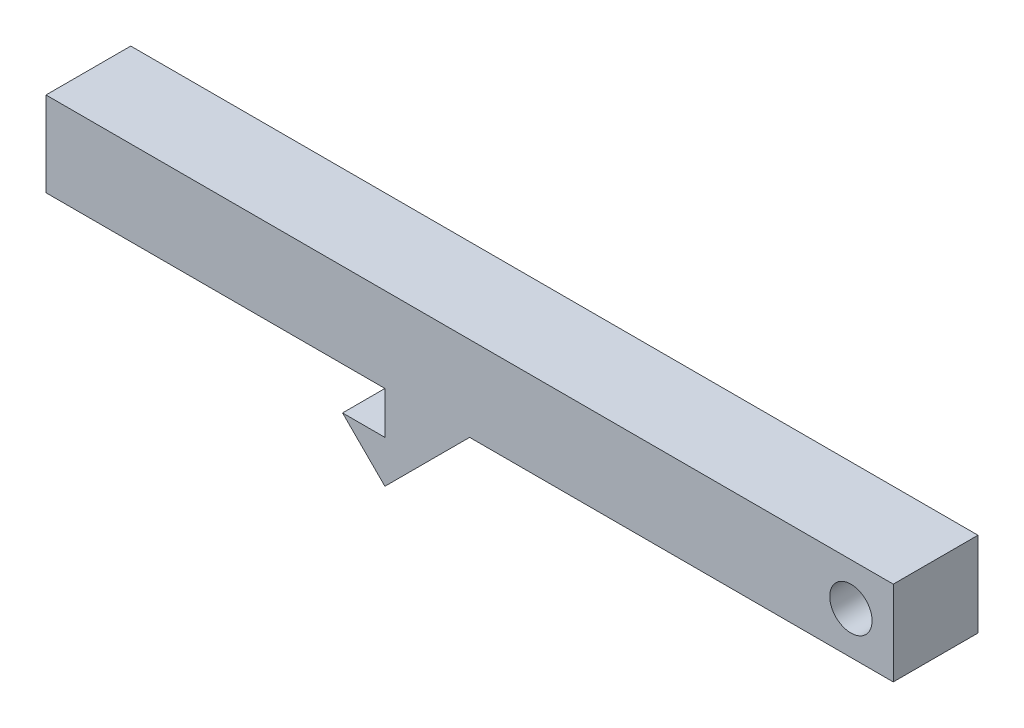
ISO-10303-21;
HEADER;
FILE_DESCRIPTION(('STEP AP214'),'2;1');
FILE_NAME('part.step','',(''),(''),'','','');
FILE_SCHEMA(('AUTOMOTIVE_DESIGN { 1 0 10303 214 1 1 1 1 }'));
ENDSEC;
DATA;
#1=APPLICATION_CONTEXT('core data for automotive mechanical design processes');
#2=APPLICATION_PROTOCOL_DEFINITION('international standard','automotive_design',2000,#1);
#3=PRODUCT_CONTEXT('',#1,'mechanical');
#4=PRODUCT('Part','Part','',(#3));
#5=PRODUCT_RELATED_PRODUCT_CATEGORY('part','',(#4));
#6=PRODUCT_DEFINITION_FORMATION('','',#4);
#7=PRODUCT_DEFINITION_CONTEXT('part definition',#1,'design');
#8=PRODUCT_DEFINITION('design','',#6,#7);
#9=PRODUCT_DEFINITION_SHAPE('','',#8);
#10=(LENGTH_UNIT() NAMED_UNIT(*) SI_UNIT(.MILLI.,.METRE.));
#11=(NAMED_UNIT(*) PLANE_ANGLE_UNIT() SI_UNIT($,.RADIAN.));
#12=(NAMED_UNIT(*) SI_UNIT($,.STERADIAN.) SOLID_ANGLE_UNIT());
#13=UNCERTAINTY_MEASURE_WITH_UNIT(LENGTH_MEASURE(1.E-05),#10,'distance_accuracy_value','');
#14=(GEOMETRIC_REPRESENTATION_CONTEXT(3) GLOBAL_UNCERTAINTY_ASSIGNED_CONTEXT((#13)) GLOBAL_UNIT_ASSIGNED_CONTEXT((#10,
#11,#12)) REPRESENTATION_CONTEXT('',''));
#15=CARTESIAN_POINT('',(0.,0.,0.));
#16=DIRECTION('',(0.,0.,1.));
#17=DIRECTION('',(1.,0.,0.));
#18=AXIS2_PLACEMENT_3D('',#15,#16,#17);
#19=CARTESIAN_POINT('',(0.,0.,2.54));
#20=DIRECTION('',(0.,1.,0.));
#21=DIRECTION('',(0.,0.,1.));
#22=AXIS2_PLACEMENT_3D('',#19,#20,#21);
#23=PLANE('',#22);
#24=DIRECTION('',(1.,0.,0.));
#25=VECTOR('',#24,1.);
#26=CARTESIAN_POINT('',(0.,0.,0.));
#27=LINE('',#26,#25);
#28=CARTESIAN_POINT('',(0.,0.,0.));
#29=VERTEX_POINT('',#28);
#30=CARTESIAN_POINT('',(10.16,0.,0.));
#31=VERTEX_POINT('',#30);
#32=EDGE_CURVE('E154',#29,#31,#27,.T.);
#33=ORIENTED_EDGE('',*,*,#32,.T.);
#34=DIRECTION('',(0.,0.,-1.));
#35=VECTOR('',#34,1.);
#36=CARTESIAN_POINT('',(10.16,0.,2.54));
#37=LINE('',#36,#35);
#38=CARTESIAN_POINT('',(10.16,0.,2.54));
#39=VERTEX_POINT('',#38);
#40=EDGE_CURVE('E11',#39,#31,#37,.T.);
#41=ORIENTED_EDGE('',*,*,#40,.F.);
#42=DIRECTION('',(1.,0.,0.));
#43=VECTOR('',#42,1.);
#44=CARTESIAN_POINT('',(0.,0.,2.54));
#45=LINE('',#44,#43);
#46=CARTESIAN_POINT('',(0.,0.,2.54));
#47=VERTEX_POINT('',#46);
#48=EDGE_CURVE('E190',#47,#39,#45,.T.);
#49=ORIENTED_EDGE('',*,*,#48,.F.);
#50=DIRECTION('',(0.,0.,-1.));
#51=VECTOR('',#50,1.);
#52=CARTESIAN_POINT('',(0.,0.,2.54));
#53=LINE('',#52,#51);
#54=EDGE_CURVE('E58',#47,#29,#53,.T.);
#55=ORIENTED_EDGE('',*,*,#54,.T.);
#56=EDGE_LOOP('',(#33,#41,#49,#55));
#57=FACE_BOUND('',#56,.T.);
#58=ADVANCED_FACE('F41',(#57),#23,.F.);
#59=CARTESIAN_POINT('',(10.16,0.,2.54));
#60=DIRECTION('',(1.,0.,0.));
#61=DIRECTION('',(0.,0.,-1.));
#62=AXIS2_PLACEMENT_3D('',#59,#60,#61);
#63=PLANE('',#62);
#64=DIRECTION('',(0.,-1.,0.));
#65=VECTOR('',#64,1.);
#66=CARTESIAN_POINT('',(10.16,0.,0.));
#67=LINE('',#66,#65);
#68=CARTESIAN_POINT('',(10.16,-1.27017849528637,0.));
#69=VERTEX_POINT('',#68);
#70=EDGE_CURVE('E157',#31,#69,#67,.T.);
#71=ORIENTED_EDGE('',*,*,#70,.T.);
#72=DIRECTION('',(0.,0.,-1.));
#73=VECTOR('',#72,1.);
#74=CARTESIAN_POINT('',(10.16,-1.27017849528637,2.54));
#75=LINE('',#74,#73);
#76=CARTESIAN_POINT('',(10.16,-1.27017849528637,2.54));
#77=VERTEX_POINT('',#76);
#78=EDGE_CURVE('E50',#77,#69,#75,.T.);
#79=ORIENTED_EDGE('',*,*,#78,.F.);
#80=DIRECTION('',(0.,-1.,0.));
#81=VECTOR('',#80,1.);
#82=CARTESIAN_POINT('',(10.16,0.,2.54));
#83=LINE('',#82,#81);
#84=EDGE_CURVE('E99',#39,#77,#83,.T.);
#85=ORIENTED_EDGE('',*,*,#84,.F.);
#86=ORIENTED_EDGE('',*,*,#40,.T.);
#87=EDGE_LOOP('',(#71,#79,#85,#86));
#88=FACE_BOUND('',#87,.T.);
#89=ADVANCED_FACE('F212',(#88),#63,.F.);
#90=CARTESIAN_POINT('',(0.,-1.27017849528637,2.54));
#91=DIRECTION('',(0.,1.,0.));
#92=DIRECTION('',(-1.,0.,0.));
#93=AXIS2_PLACEMENT_3D('',#90,#91,#92);
#94=PLANE('',#93);
#95=DIRECTION('',(1.,0.,0.));
#96=VECTOR('',#95,1.);
#97=CARTESIAN_POINT('',(0.,-1.27017849528637,0.));
#98=LINE('',#97,#96);
#99=CARTESIAN_POINT('',(8.89017849528629,-1.27017849528637,0.));
#100=VERTEX_POINT('',#99);
#101=EDGE_CURVE('E161',#100,#69,#98,.T.);
#102=ORIENTED_EDGE('',*,*,#101,.F.);
#103=DIRECTION('',(0.,0.,-1.));
#104=VECTOR('',#103,1.);
#105=CARTESIAN_POINT('',(8.89017849528629,-1.27017849528637,2.54));
#106=LINE('',#105,#104);
#107=CARTESIAN_POINT('',(8.89017849528629,-1.27017849528637,2.54));
#108=VERTEX_POINT('',#107);
#109=EDGE_CURVE('E203',#108,#100,#106,.T.);
#110=ORIENTED_EDGE('',*,*,#109,.F.);
#111=DIRECTION('',(1.,0.,0.));
#112=VECTOR('',#111,1.);
#113=CARTESIAN_POINT('',(0.,-1.27017849528637,2.54));
#114=LINE('',#113,#112);
#115=EDGE_CURVE('E211',#108,#77,#114,.T.);
#116=ORIENTED_EDGE('',*,*,#115,.T.);
#117=ORIENTED_EDGE('',*,*,#78,.T.);
#118=EDGE_LOOP('',(#102,#110,#116,#117));
#119=FACE_BOUND('',#118,.T.);
#120=ADVANCED_FACE('F209',(#119),#94,.T.);
#121=CARTESIAN_POINT('',(3.80999999999989,3.80999999999995,2.54));
#122=DIRECTION('',(-0.707106781186542,-0.707106781186553,0.));
#123=DIRECTION('',(0.707106781186553,-0.707106781186542,0.));
#124=AXIS2_PLACEMENT_3D('',#121,#122,#123);
#125=PLANE('',#124);
#126=DIRECTION('',(-0.707106781186553,0.707106781186542,0.));
#127=VECTOR('',#126,1.);
#128=CARTESIAN_POINT('',(3.80999999999989,3.80999999999995,0.));
#129=LINE('',#128,#127);
#130=CARTESIAN_POINT('',(10.16,-2.54000000000005,0.));
#131=VERTEX_POINT('',#130);
#132=EDGE_CURVE('E165',#131,#100,#129,.T.);
#133=ORIENTED_EDGE('',*,*,#132,.F.);
#134=DIRECTION('',(0.,0.,-1.));
#135=VECTOR('',#134,1.);
#136=CARTESIAN_POINT('',(10.16,-2.54000000000005,2.54));
#137=LINE('',#136,#135);
#138=CARTESIAN_POINT('',(10.16,-2.54000000000005,2.54));
#139=VERTEX_POINT('',#138);
#140=EDGE_CURVE('E200',#139,#131,#137,.T.);
#141=ORIENTED_EDGE('',*,*,#140,.F.);
#142=DIRECTION('',(-0.707106781186553,0.707106781186542,0.));
#143=VECTOR('',#142,1.);
#144=CARTESIAN_POINT('',(3.80999999999989,3.80999999999995,2.54));
#145=LINE('',#144,#143);
#146=EDGE_CURVE('E224',#139,#108,#145,.T.);
#147=ORIENTED_EDGE('',*,*,#146,.T.);
#148=ORIENTED_EDGE('',*,*,#109,.T.);
#149=EDGE_LOOP('',(#133,#141,#147,#148));
#150=FACE_BOUND('',#149,.T.);
#151=ADVANCED_FACE('F221',(#150),#125,.T.);
#152=CARTESIAN_POINT('',(6.3500000000001,-6.35,2.54));
#153=DIRECTION('',(0.707106781186553,-0.707106781186542,0.));
#154=DIRECTION('',(0.707106781186542,0.707106781186553,0.));
#155=AXIS2_PLACEMENT_3D('',#152,#153,#154);
#156=PLANE('',#155);
#157=DIRECTION('',(-0.707106781186542,-0.707106781186553,0.));
#158=VECTOR('',#157,1.);
#159=CARTESIAN_POINT('',(6.3500000000001,-6.35,0.));
#160=LINE('',#159,#158);
#161=CARTESIAN_POINT('',(12.7,0.,0.));
#162=VERTEX_POINT('',#161);
#163=EDGE_CURVE('E169',#162,#131,#160,.T.);
#164=ORIENTED_EDGE('',*,*,#163,.F.);
#165=DIRECTION('',(0.,0.,-1.));
#166=VECTOR('',#165,1.);
#167=CARTESIAN_POINT('',(12.7,0.,2.54));
#168=LINE('',#167,#166);
#169=CARTESIAN_POINT('',(12.7,0.,2.54));
#170=VERTEX_POINT('',#169);
#171=EDGE_CURVE('E197',#170,#162,#168,.T.);
#172=ORIENTED_EDGE('',*,*,#171,.F.);
#173=DIRECTION('',(-0.707106781186542,-0.707106781186553,0.));
#174=VECTOR('',#173,1.);
#175=CARTESIAN_POINT('',(6.3500000000001,-6.35,2.54));
#176=LINE('',#175,#174);
#177=EDGE_CURVE('E230',#170,#139,#176,.T.);
#178=ORIENTED_EDGE('',*,*,#177,.T.);
#179=ORIENTED_EDGE('',*,*,#140,.T.);
#180=EDGE_LOOP('',(#164,#172,#178,#179));
#181=FACE_BOUND('',#180,.T.);
#182=ADVANCED_FACE('F238',(#181),#156,.T.);
#183=CARTESIAN_POINT('',(0.,0.,2.54));
#184=DIRECTION('',(0.,1.,0.));
#185=DIRECTION('',(0.,0.,1.));
#186=AXIS2_PLACEMENT_3D('',#183,#184,#185);
#187=PLANE('',#186);
#188=DIRECTION('',(1.,0.,0.));
#189=VECTOR('',#188,1.);
#190=CARTESIAN_POINT('',(0.,0.,0.));
#191=LINE('',#190,#189);
#192=CARTESIAN_POINT('',(25.4,0.,0.));
#193=VERTEX_POINT('',#192);
#194=EDGE_CURVE('E173',#162,#193,#191,.T.);
#195=ORIENTED_EDGE('',*,*,#194,.T.);
#196=DIRECTION('',(0.,0.,-1.));
#197=VECTOR('',#196,1.);
#198=CARTESIAN_POINT('',(25.4,0.,2.54));
#199=LINE('',#198,#197);
#200=CARTESIAN_POINT('',(25.4,0.,2.54));
#201=VERTEX_POINT('',#200);
#202=EDGE_CURVE('E128',#201,#193,#199,.T.);
#203=ORIENTED_EDGE('',*,*,#202,.F.);
#204=DIRECTION('',(1.,0.,0.));
#205=VECTOR('',#204,1.);
#206=CARTESIAN_POINT('',(0.,0.,2.54));
#207=LINE('',#206,#205);
#208=EDGE_CURVE('E138',#170,#201,#207,.T.);
#209=ORIENTED_EDGE('',*,*,#208,.F.);
#210=ORIENTED_EDGE('',*,*,#171,.T.);
#211=EDGE_LOOP('',(#195,#203,#209,#210));
#212=FACE_BOUND('',#211,.T.);
#213=ADVANCED_FACE('F240',(#212),#187,.F.);
#214=CARTESIAN_POINT('',(25.4,0.,2.54));
#215=DIRECTION('',(1.,0.,0.));
#216=DIRECTION('',(0.,0.,-1.));
#217=AXIS2_PLACEMENT_3D('',#214,#215,#216);
#218=PLANE('',#217);
#219=DIRECTION('',(0.,-1.,0.));
#220=VECTOR('',#219,1.);
#221=CARTESIAN_POINT('',(25.4,0.,0.));
#222=LINE('',#221,#220);
#223=CARTESIAN_POINT('',(25.4,2.54,0.));
#224=VERTEX_POINT('',#223);
#225=EDGE_CURVE('E123',#224,#193,#222,.T.);
#226=ORIENTED_EDGE('',*,*,#225,.F.);
#227=DIRECTION('',(0.,0.,-1.));
#228=VECTOR('',#227,1.);
#229=CARTESIAN_POINT('',(25.4,2.54,2.54));
#230=LINE('',#229,#228);
#231=CARTESIAN_POINT('',(25.4,2.54,2.54));
#232=VERTEX_POINT('',#231);
#233=EDGE_CURVE('E118',#232,#224,#230,.T.);
#234=ORIENTED_EDGE('',*,*,#233,.F.);
#235=DIRECTION('',(0.,-1.,0.));
#236=VECTOR('',#235,1.);
#237=CARTESIAN_POINT('',(25.4,0.,2.54));
#238=LINE('',#237,#236);
#239=EDGE_CURVE('E121',#232,#201,#238,.T.);
#240=ORIENTED_EDGE('',*,*,#239,.T.);
#241=ORIENTED_EDGE('',*,*,#202,.T.);
#242=EDGE_LOOP('',(#226,#234,#240,#241));
#243=FACE_BOUND('',#242,.T.);
#244=ADVANCED_FACE('F120',(#243),#218,.T.);
#245=CARTESIAN_POINT('',(0.,2.54,2.54));
#246=DIRECTION('',(0.,1.,0.));
#247=DIRECTION('',(0.,0.,1.));
#248=AXIS2_PLACEMENT_3D('',#245,#246,#247);
#249=PLANE('',#248);
#250=DIRECTION('',(1.,0.,0.));
#251=VECTOR('',#250,1.);
#252=CARTESIAN_POINT('',(0.,2.54,0.));
#253=LINE('',#252,#251);
#254=CARTESIAN_POINT('',(0.,2.54,0.));
#255=VERTEX_POINT('',#254);
#256=EDGE_CURVE('E179',#255,#224,#253,.T.);
#257=ORIENTED_EDGE('',*,*,#256,.F.);
#258=DIRECTION('',(0.,0.,-1.));
#259=VECTOR('',#258,1.);
#260=CARTESIAN_POINT('',(0.,2.54,2.54));
#261=LINE('',#260,#259);
#262=CARTESIAN_POINT('',(0.,2.54,2.54));
#263=VERTEX_POINT('',#262);
#264=EDGE_CURVE('E87',#263,#255,#261,.T.);
#265=ORIENTED_EDGE('',*,*,#264,.F.);
#266=DIRECTION('',(1.,0.,0.));
#267=VECTOR('',#266,1.);
#268=CARTESIAN_POINT('',(0.,2.54,2.54));
#269=LINE('',#268,#267);
#270=EDGE_CURVE('E135',#263,#232,#269,.T.);
#271=ORIENTED_EDGE('',*,*,#270,.T.);
#272=ORIENTED_EDGE('',*,*,#233,.T.);
#273=EDGE_LOOP('',(#257,#265,#271,#272));
#274=FACE_BOUND('',#273,.T.);
#275=ADVANCED_FACE('F142',(#274),#249,.T.);
#276=CARTESIAN_POINT('',(0.,0.,2.54));
#277=DIRECTION('',(-1.,0.,0.));
#278=DIRECTION('',(0.,0.,1.));
#279=AXIS2_PLACEMENT_3D('',#276,#277,#278);
#280=PLANE('',#279);
#281=DIRECTION('',(0.,1.,0.));
#282=VECTOR('',#281,1.);
#283=CARTESIAN_POINT('',(0.,0.,0.));
#284=LINE('',#283,#282);
#285=EDGE_CURVE('E182',#29,#255,#284,.T.);
#286=ORIENTED_EDGE('',*,*,#285,.F.);
#287=ORIENTED_EDGE('',*,*,#54,.F.);
#288=DIRECTION('',(0.,1.,0.));
#289=VECTOR('',#288,1.);
#290=CARTESIAN_POINT('',(0.,0.,2.54));
#291=LINE('',#290,#289);
#292=EDGE_CURVE('E144',#47,#263,#291,.T.);
#293=ORIENTED_EDGE('',*,*,#292,.T.);
#294=ORIENTED_EDGE('',*,*,#264,.T.);
#295=EDGE_LOOP('',(#286,#287,#293,#294));
#296=FACE_BOUND('',#295,.T.);
#297=ADVANCED_FACE('F241',(#296),#280,.T.);
#298=CARTESIAN_POINT('',(24.13,1.27,2.54));
#299=DIRECTION('',(0.,0.,-1.));
#300=DIRECTION('',(-1.,0.,0.));
#301=AXIS2_PLACEMENT_3D('',#298,#299,#300);
#302=CYLINDRICAL_SURFACE('',#301,0.634999999999999);
#303=CARTESIAN_POINT('',(24.13,1.27,2.54));
#304=DIRECTION('',(0.,0.,1.));
#305=DIRECTION('',(1.,0.,0.));
#306=AXIS2_PLACEMENT_3D('',#303,#304,#305);
#307=CIRCLE('',#306,0.634999999999999);
#308=CARTESIAN_POINT('',(24.765,1.27,2.54));
#309=VERTEX_POINT('',#308);
#310=EDGE_CURVE('E147',#309,#309,#307,.T.);
#311=ORIENTED_EDGE('',*,*,#310,.T.);
#312=EDGE_LOOP('',(#311));
#313=FACE_BOUND('',#312,.T.);
#314=CARTESIAN_POINT('',(24.13,1.27,0.));
#315=DIRECTION('',(0.,0.,1.));
#316=DIRECTION('',(1.,0.,0.));
#317=AXIS2_PLACEMENT_3D('',#314,#315,#316);
#318=CIRCLE('',#317,0.634999999999999);
#319=CARTESIAN_POINT('',(24.765,1.27,0.));
#320=VERTEX_POINT('',#319);
#321=EDGE_CURVE('E186',#320,#320,#318,.T.);
#322=ORIENTED_EDGE('',*,*,#321,.F.);
#323=EDGE_LOOP('',(#322));
#324=FACE_BOUND('',#323,.T.);
#325=ADVANCED_FACE('F243',(#313,#324),#302,.F.);
#326=CARTESIAN_POINT('',(0.,0.,2.54));
#327=DIRECTION('',(0.,0.,1.));
#328=DIRECTION('',(1.,0.,0.));
#329=AXIS2_PLACEMENT_3D('',#326,#327,#328);
#330=PLANE('',#329);
#331=ORIENTED_EDGE('',*,*,#48,.T.);
#332=ORIENTED_EDGE('',*,*,#84,.T.);
#333=ORIENTED_EDGE('',*,*,#115,.F.);
#334=ORIENTED_EDGE('',*,*,#146,.F.);
#335=ORIENTED_EDGE('',*,*,#177,.F.);
#336=ORIENTED_EDGE('',*,*,#208,.T.);
#337=ORIENTED_EDGE('',*,*,#239,.F.);
#338=ORIENTED_EDGE('',*,*,#270,.F.);
#339=ORIENTED_EDGE('',*,*,#292,.F.);
#340=EDGE_LOOP('',(#331,#332,#333,#334,#335,#336,#337,#338,#339));
#341=FACE_BOUND('',#340,.T.);
#342=ORIENTED_EDGE('',*,*,#310,.F.);
#343=EDGE_LOOP('',(#342));
#344=FACE_BOUND('',#343,.T.);
#345=ADVANCED_FACE('F132',(#341,#344),#330,.T.);
#346=CARTESIAN_POINT('',(0.,0.,0.));
#347=DIRECTION('',(0.,0.,1.));
#348=DIRECTION('',(1.,0.,0.));
#349=AXIS2_PLACEMENT_3D('',#346,#347,#348);
#350=PLANE('',#349);
#351=ORIENTED_EDGE('',*,*,#32,.F.);
#352=ORIENTED_EDGE('',*,*,#285,.T.);
#353=ORIENTED_EDGE('',*,*,#256,.T.);
#354=ORIENTED_EDGE('',*,*,#225,.T.);
#355=ORIENTED_EDGE('',*,*,#194,.F.);
#356=ORIENTED_EDGE('',*,*,#163,.T.);
#357=ORIENTED_EDGE('',*,*,#132,.T.);
#358=ORIENTED_EDGE('',*,*,#101,.T.);
#359=ORIENTED_EDGE('',*,*,#70,.F.);
#360=EDGE_LOOP('',(#351,#352,#353,#354,#355,#356,#357,#358,#359));
#361=FACE_BOUND('',#360,.T.);
#362=ORIENTED_EDGE('',*,*,#321,.T.);
#363=EDGE_LOOP('',(#362));
#364=FACE_BOUND('',#363,.T.);
#365=ADVANCED_FACE('F215',(#361,#364),#350,.F.);
#366=CLOSED_SHELL('',(#58,#89,#120,#151,#182,#213,#244,#275,#297,#325,#345,#365));
#367=MANIFOLD_SOLID_BREP('B2',#366);
#368=ADVANCED_BREP_SHAPE_REPRESENTATION('',(#18,#367),#14);
#369=SHAPE_DEFINITION_REPRESENTATION(#9,#368);
ENDSEC;
END-ISO-10303-21;
